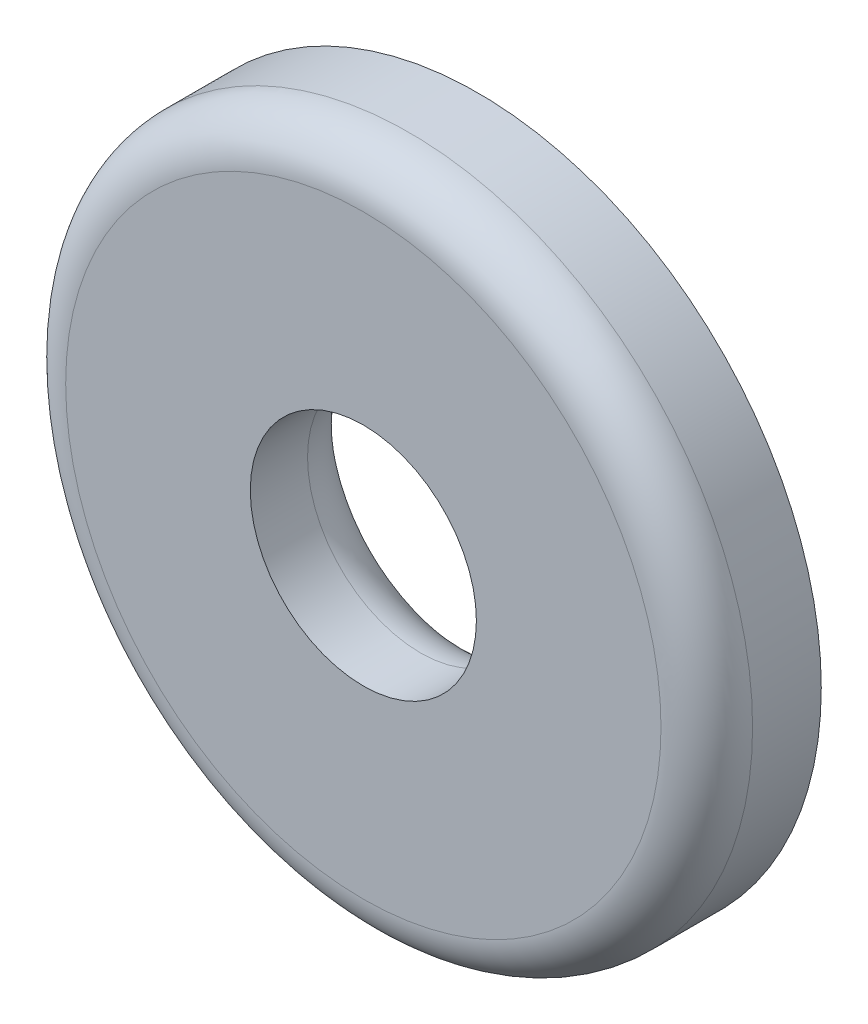
ISO-10303-21;
HEADER;
FILE_DESCRIPTION(('STEP AP214'),'2;1');
FILE_NAME('part.step','',(''),(''),'','','');
FILE_SCHEMA(('AUTOMOTIVE_DESIGN { 1 0 10303 214 1 1 1 1 }'));
ENDSEC;
DATA;
#1=APPLICATION_CONTEXT('core data for automotive mechanical design processes');
#2=APPLICATION_PROTOCOL_DEFINITION('international standard','automotive_design',2000,#1);
#3=PRODUCT_CONTEXT('',#1,'mechanical');
#4=PRODUCT('Part','Part','',(#3));
#5=PRODUCT_RELATED_PRODUCT_CATEGORY('part','',(#4));
#6=PRODUCT_DEFINITION_FORMATION('','',#4);
#7=PRODUCT_DEFINITION_CONTEXT('part definition',#1,'design');
#8=PRODUCT_DEFINITION('design','',#6,#7);
#9=PRODUCT_DEFINITION_SHAPE('','',#8);
#10=(LENGTH_UNIT() NAMED_UNIT(*) SI_UNIT(.MILLI.,.METRE.));
#11=(NAMED_UNIT(*) PLANE_ANGLE_UNIT() SI_UNIT($,.RADIAN.));
#12=(NAMED_UNIT(*) SI_UNIT($,.STERADIAN.) SOLID_ANGLE_UNIT());
#13=UNCERTAINTY_MEASURE_WITH_UNIT(LENGTH_MEASURE(1.E-05),#10,'distance_accuracy_value','');
#14=(GEOMETRIC_REPRESENTATION_CONTEXT(3) GLOBAL_UNCERTAINTY_ASSIGNED_CONTEXT((#13)) GLOBAL_UNIT_ASSIGNED_CONTEXT((#10,
#11,#12)) REPRESENTATION_CONTEXT('',''));
#15=CARTESIAN_POINT('',(0.,0.,0.));
#16=DIRECTION('',(0.,0.,1.));
#17=DIRECTION('',(1.,0.,0.));
#18=AXIS2_PLACEMENT_3D('',#15,#16,#17);
#19=CARTESIAN_POINT('',(-81.4330065884624,0.,10.));
#20=DIRECTION('',(0.,0.,1.));
#21=DIRECTION('',(1.,0.,0.));
#22=AXIS2_PLACEMENT_3D('',#19,#20,#21);
#23=PLANE('',#22);
#24=CARTESIAN_POINT('',(-81.4330065884624,0.,10.));
#25=DIRECTION('',(0.,0.,1.));
#26=DIRECTION('',(1.,0.,0.));
#27=AXIS2_PLACEMENT_3D('',#24,#25,#26);
#28=CIRCLE('',#27,26.);
#29=CARTESIAN_POINT('',(-55.4330065884624,0.,10.));
#30=VERTEX_POINT('',#29);
#31=EDGE_CURVE('E46',#30,#30,#28,.T.);
#32=ORIENTED_EDGE('',*,*,#31,.T.);
#33=EDGE_LOOP('',(#32));
#34=FACE_BOUND('',#33,.T.);
#35=CARTESIAN_POINT('',(-81.4330065884624,0.,10.));
#36=DIRECTION('',(0.,0.,1.));
#37=DIRECTION('',(1.,0.,0.));
#38=AXIS2_PLACEMENT_3D('',#35,#36,#37);
#39=CIRCLE('',#38,9.87500000000002);
#40=CARTESIAN_POINT('',(-71.5580065884624,0.,10.));
#41=VERTEX_POINT('',#40);
#42=EDGE_CURVE('E54',#41,#41,#39,.T.);
#43=ORIENTED_EDGE('',*,*,#42,.F.);
#44=EDGE_LOOP('',(#43));
#45=FACE_BOUND('',#44,.T.);
#46=ADVANCED_FACE('F31',(#34,#45),#23,.T.);
#47=CARTESIAN_POINT('',(-81.4330065884624,0.,0.));
#48=DIRECTION('',(0.,0.,1.));
#49=DIRECTION('',(1.,0.,0.));
#50=AXIS2_PLACEMENT_3D('',#47,#48,#49);
#51=PLANE('',#50);
#52=CARTESIAN_POINT('',(-81.4330065884624,0.,0.));
#53=DIRECTION('',(0.,0.,1.));
#54=DIRECTION('',(1.,0.,0.));
#55=AXIS2_PLACEMENT_3D('',#52,#53,#54);
#56=CIRCLE('',#55,14.875);
#57=CARTESIAN_POINT('',(-66.5580065884624,0.,0.));
#58=VERTEX_POINT('',#57);
#59=EDGE_CURVE('E38',#58,#58,#56,.T.);
#60=ORIENTED_EDGE('',*,*,#59,.T.);
#61=EDGE_LOOP('',(#60));
#62=FACE_BOUND('',#61,.T.);
#63=CARTESIAN_POINT('',(-81.4330065884624,0.,0.));
#64=DIRECTION('',(0.,0.,1.));
#65=DIRECTION('',(1.,0.,0.));
#66=AXIS2_PLACEMENT_3D('',#63,#64,#65);
#67=CIRCLE('',#66,30.);
#68=CARTESIAN_POINT('',(-51.4330065884624,0.,0.));
#69=VERTEX_POINT('',#68);
#70=EDGE_CURVE('E51',#69,#69,#67,.T.);
#71=ORIENTED_EDGE('',*,*,#70,.F.);
#72=EDGE_LOOP('',(#71));
#73=FACE_BOUND('',#72,.T.);
#74=ADVANCED_FACE('F61',(#62,#73),#51,.F.);
#75=CARTESIAN_POINT('',(-81.4330065884624,0.,10.));
#76=DIRECTION('',(0.,0.,-1.));
#77=DIRECTION('',(-1.,0.,0.));
#78=AXIS2_PLACEMENT_3D('',#75,#76,#77);
#79=CYLINDRICAL_SURFACE('',#78,30.);
#80=CARTESIAN_POINT('',(-81.4330065884624,0.,6.));
#81=DIRECTION('',(0.,0.,1.));
#82=DIRECTION('',(1.,0.,0.));
#83=AXIS2_PLACEMENT_3D('',#80,#81,#82);
#84=CIRCLE('',#83,30.);
#85=CARTESIAN_POINT('',(-51.4330065884624,0.,6.));
#86=VERTEX_POINT('',#85);
#87=EDGE_CURVE('E42',#86,#86,#84,.F.);
#88=ORIENTED_EDGE('',*,*,#87,.T.);
#89=EDGE_LOOP('',(#88));
#90=FACE_BOUND('',#89,.T.);
#91=ORIENTED_EDGE('',*,*,#70,.T.);
#92=EDGE_LOOP('',(#91));
#93=FACE_BOUND('',#92,.T.);
#94=ADVANCED_FACE('F67',(#90,#93),#79,.T.);
#95=CARTESIAN_POINT('',(-81.4330065884624,0.,10.));
#96=DIRECTION('',(0.,0.,-1.));
#97=DIRECTION('',(-1.,0.,0.));
#98=AXIS2_PLACEMENT_3D('',#95,#96,#97);
#99=CYLINDRICAL_SURFACE('',#98,9.87500000000002);
#100=CARTESIAN_POINT('',(-81.4330065884624,0.,5.));
#101=DIRECTION('',(0.,0.,1.));
#102=DIRECTION('',(1.,0.,0.));
#103=AXIS2_PLACEMENT_3D('',#100,#101,#102);
#104=CIRCLE('',#103,9.87500000000002);
#105=CARTESIAN_POINT('',(-71.5580065884624,0.,5.));
#106=VERTEX_POINT('',#105);
#107=EDGE_CURVE('E10',#106,#106,#104,.F.);
#108=ORIENTED_EDGE('',*,*,#107,.T.);
#109=EDGE_LOOP('',(#108));
#110=FACE_BOUND('',#109,.T.);
#111=ORIENTED_EDGE('',*,*,#42,.T.);
#112=EDGE_LOOP('',(#111));
#113=FACE_BOUND('',#112,.T.);
#114=ADVANCED_FACE('F58',(#110,#113),#99,.F.);
#115=CARTESIAN_POINT('',(-81.4330065884624,0.,6.));
#116=DIRECTION('',(0.,0.,1.));
#117=DIRECTION('',(1.,0.,0.));
#118=AXIS2_PLACEMENT_3D('',#115,#116,#117);
#119=TOROIDAL_SURFACE('',#118,26.,4.);
#120=ORIENTED_EDGE('',*,*,#87,.F.);
#121=EDGE_LOOP('',(#120));
#122=FACE_BOUND('',#121,.T.);
#123=ORIENTED_EDGE('',*,*,#31,.F.);
#124=EDGE_LOOP('',(#123));
#125=FACE_BOUND('',#124,.T.);
#126=ADVANCED_FACE('F73',(#122,#125),#119,.T.);
#127=CARTESIAN_POINT('',(-81.4330065884624,0.,5.));
#128=DIRECTION('',(0.,0.,1.));
#129=DIRECTION('',(1.,0.,0.));
#130=AXIS2_PLACEMENT_3D('',#127,#128,#129);
#131=TOROIDAL_SURFACE('',#130,14.875,5.);
#132=ORIENTED_EDGE('',*,*,#107,.F.);
#133=EDGE_LOOP('',(#132));
#134=FACE_BOUND('',#133,.T.);
#135=ORIENTED_EDGE('',*,*,#59,.F.);
#136=EDGE_LOOP('',(#135));
#137=FACE_BOUND('',#136,.T.);
#138=ADVANCED_FACE('F33',(#134,#137),#131,.T.);
#139=CLOSED_SHELL('',(#46,#74,#94,#114,#126,#138));
#140=MANIFOLD_SOLID_BREP('B2',#139);
#141=ADVANCED_BREP_SHAPE_REPRESENTATION('',(#18,#140),#14);
#142=SHAPE_DEFINITION_REPRESENTATION(#9,#141);
ENDSEC;
END-ISO-10303-21;
